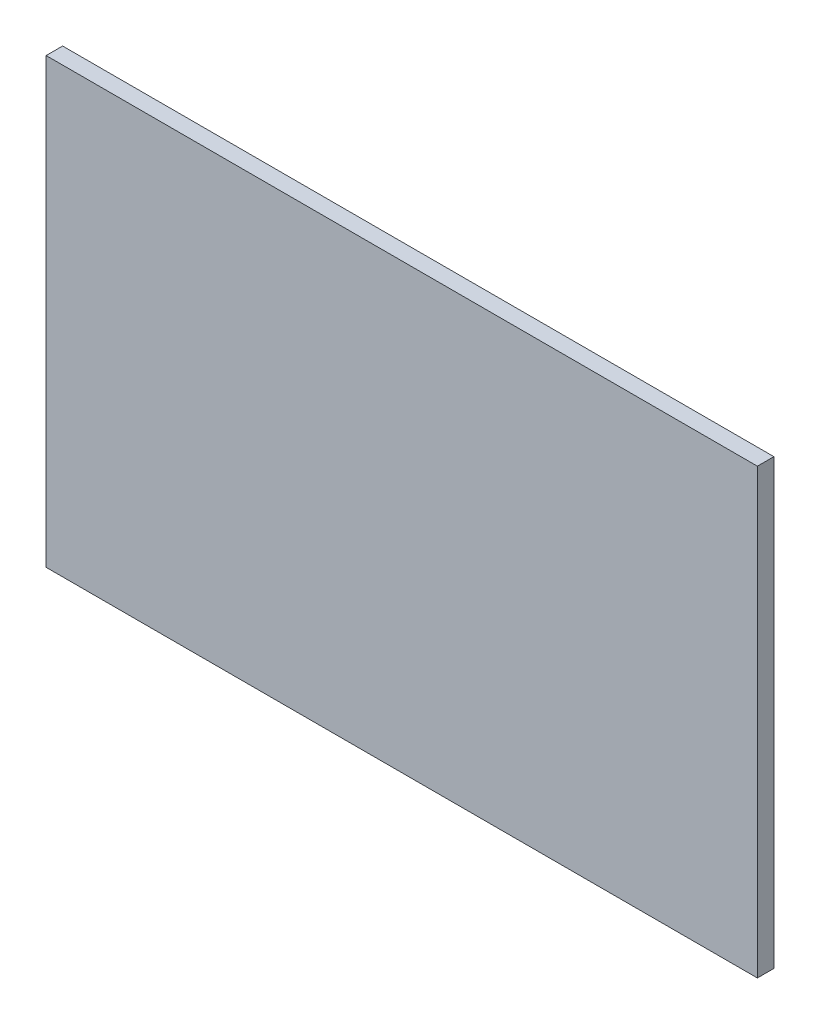
ISO-10303-21;
HEADER;
FILE_DESCRIPTION(('STEP AP214'),'2;1');
FILE_NAME('part.step','',(''),(''),'','','');
FILE_SCHEMA(('AUTOMOTIVE_DESIGN { 1 0 10303 214 1 1 1 1 }'));
ENDSEC;
DATA;
#1=APPLICATION_CONTEXT('core data for automotive mechanical design processes');
#2=APPLICATION_PROTOCOL_DEFINITION('international standard','automotive_design',2000,#1);
#3=PRODUCT_CONTEXT('',#1,'mechanical');
#4=PRODUCT('Part','Part','',(#3));
#5=PRODUCT_RELATED_PRODUCT_CATEGORY('part','',(#4));
#6=PRODUCT_DEFINITION_FORMATION('','',#4);
#7=PRODUCT_DEFINITION_CONTEXT('part definition',#1,'design');
#8=PRODUCT_DEFINITION('design','',#6,#7);
#9=PRODUCT_DEFINITION_SHAPE('','',#8);
#10=(LENGTH_UNIT() NAMED_UNIT(*) SI_UNIT(.MILLI.,.METRE.));
#11=(NAMED_UNIT(*) PLANE_ANGLE_UNIT() SI_UNIT($,.RADIAN.));
#12=(NAMED_UNIT(*) SI_UNIT($,.STERADIAN.) SOLID_ANGLE_UNIT());
#13=UNCERTAINTY_MEASURE_WITH_UNIT(LENGTH_MEASURE(1.E-05),#10,'distance_accuracy_value','');
#14=(GEOMETRIC_REPRESENTATION_CONTEXT(3) GLOBAL_UNCERTAINTY_ASSIGNED_CONTEXT((#13)) GLOBAL_UNIT_ASSIGNED_CONTEXT((#10,
#11,#12)) REPRESENTATION_CONTEXT('',''));
#15=CARTESIAN_POINT('',(0.,0.,0.));
#16=DIRECTION('',(0.,0.,1.));
#17=DIRECTION('',(1.,0.,0.));
#18=AXIS2_PLACEMENT_3D('',#15,#16,#17);
#19=CARTESIAN_POINT('',(69.,-43.,3.2));
#20=DIRECTION('',(-1.,0.,0.));
#21=DIRECTION('',(0.,0.,1.));
#22=AXIS2_PLACEMENT_3D('',#19,#20,#21);
#23=PLANE('',#22);
#24=DIRECTION('',(0.,1.,0.));
#25=VECTOR('',#24,1.);
#26=CARTESIAN_POINT('',(69.,-43.,0.));
#27=LINE('',#26,#25);
#28=CARTESIAN_POINT('',(69.,-43.,0.));
#29=VERTEX_POINT('',#28);
#30=CARTESIAN_POINT('',(69.,43.,0.));
#31=VERTEX_POINT('',#30);
#32=EDGE_CURVE('E107',#29,#31,#27,.T.);
#33=ORIENTED_EDGE('',*,*,#32,.T.);
#34=DIRECTION('',(0.,0.,-1.));
#35=VECTOR('',#34,1.);
#36=CARTESIAN_POINT('',(69.,43.,3.2));
#37=LINE('',#36,#35);
#38=CARTESIAN_POINT('',(69.,43.,3.2));
#39=VERTEX_POINT('',#38);
#40=EDGE_CURVE('E11',#39,#31,#37,.T.);
#41=ORIENTED_EDGE('',*,*,#40,.F.);
#42=DIRECTION('',(0.,1.,0.));
#43=VECTOR('',#42,1.);
#44=CARTESIAN_POINT('',(69.,-43.,3.2));
#45=LINE('',#44,#43);
#46=CARTESIAN_POINT('',(69.,-43.,3.2));
#47=VERTEX_POINT('',#46);
#48=EDGE_CURVE('E91',#47,#39,#45,.T.);
#49=ORIENTED_EDGE('',*,*,#48,.F.);
#50=DIRECTION('',(0.,0.,-1.));
#51=VECTOR('',#50,1.);
#52=CARTESIAN_POINT('',(69.,-43.,3.2));
#53=LINE('',#52,#51);
#54=EDGE_CURVE('E103',#47,#29,#53,.T.);
#55=ORIENTED_EDGE('',*,*,#54,.T.);
#56=EDGE_LOOP('',(#33,#41,#49,#55));
#57=FACE_BOUND('',#56,.T.);
#58=ADVANCED_FACE('F39',(#57),#23,.F.);
#59=CARTESIAN_POINT('',(-69.,43.,3.2));
#60=DIRECTION('',(0.,-1.,0.));
#61=DIRECTION('',(0.,0.,-1.));
#62=AXIS2_PLACEMENT_3D('',#59,#60,#61);
#63=PLANE('',#62);
#64=DIRECTION('',(-1.,0.,0.));
#65=VECTOR('',#64,1.);
#66=CARTESIAN_POINT('',(-69.,43.,0.));
#67=LINE('',#66,#65);
#68=CARTESIAN_POINT('',(-69.,43.,0.));
#69=VERTEX_POINT('',#68);
#70=EDGE_CURVE('E96',#31,#69,#67,.T.);
#71=ORIENTED_EDGE('',*,*,#70,.T.);
#72=DIRECTION('',(0.,0.,-1.));
#73=VECTOR('',#72,1.);
#74=CARTESIAN_POINT('',(-69.,43.,3.2));
#75=LINE('',#74,#73);
#76=CARTESIAN_POINT('',(-69.,43.,3.2));
#77=VERTEX_POINT('',#76);
#78=EDGE_CURVE('E48',#77,#69,#75,.T.);
#79=ORIENTED_EDGE('',*,*,#78,.F.);
#80=DIRECTION('',(-1.,0.,0.));
#81=VECTOR('',#80,1.);
#82=CARTESIAN_POINT('',(-69.,43.,3.2));
#83=LINE('',#82,#81);
#84=EDGE_CURVE('E86',#39,#77,#83,.T.);
#85=ORIENTED_EDGE('',*,*,#84,.F.);
#86=ORIENTED_EDGE('',*,*,#40,.T.);
#87=EDGE_LOOP('',(#71,#79,#85,#86));
#88=FACE_BOUND('',#87,.T.);
#89=ADVANCED_FACE('F95',(#88),#63,.F.);
#90=CARTESIAN_POINT('',(-69.,-43.,3.2));
#91=DIRECTION('',(1.,0.,0.));
#92=DIRECTION('',(0.,0.,-1.));
#93=AXIS2_PLACEMENT_3D('',#90,#91,#92);
#94=PLANE('',#93);
#95=DIRECTION('',(0.,-1.,0.));
#96=VECTOR('',#95,1.);
#97=CARTESIAN_POINT('',(-69.,-43.,0.));
#98=LINE('',#97,#96);
#99=CARTESIAN_POINT('',(-69.,-43.,0.));
#100=VERTEX_POINT('',#99);
#101=EDGE_CURVE('E73',#69,#100,#98,.T.);
#102=ORIENTED_EDGE('',*,*,#101,.T.);
#103=DIRECTION('',(0.,0.,-1.));
#104=VECTOR('',#103,1.);
#105=CARTESIAN_POINT('',(-69.,-43.,3.2));
#106=LINE('',#105,#104);
#107=CARTESIAN_POINT('',(-69.,-43.,3.2));
#108=VERTEX_POINT('',#107);
#109=EDGE_CURVE('E98',#108,#100,#106,.T.);
#110=ORIENTED_EDGE('',*,*,#109,.F.);
#111=DIRECTION('',(0.,-1.,0.));
#112=VECTOR('',#111,1.);
#113=CARTESIAN_POINT('',(-69.,-43.,3.2));
#114=LINE('',#113,#112);
#115=EDGE_CURVE('E89',#77,#108,#114,.T.);
#116=ORIENTED_EDGE('',*,*,#115,.F.);
#117=ORIENTED_EDGE('',*,*,#78,.T.);
#118=EDGE_LOOP('',(#102,#110,#116,#117));
#119=FACE_BOUND('',#118,.T.);
#120=ADVANCED_FACE('F99',(#119),#94,.F.);
#121=CARTESIAN_POINT('',(-69.,-43.,3.2));
#122=DIRECTION('',(0.,1.,0.));
#123=DIRECTION('',(0.,0.,1.));
#124=AXIS2_PLACEMENT_3D('',#121,#122,#123);
#125=PLANE('',#124);
#126=DIRECTION('',(1.,0.,0.));
#127=VECTOR('',#126,1.);
#128=CARTESIAN_POINT('',(-69.,-43.,0.));
#129=LINE('',#128,#127);
#130=EDGE_CURVE('E79',#100,#29,#129,.T.);
#131=ORIENTED_EDGE('',*,*,#130,.T.);
#132=ORIENTED_EDGE('',*,*,#54,.F.);
#133=DIRECTION('',(1.,0.,0.));
#134=VECTOR('',#133,1.);
#135=CARTESIAN_POINT('',(-69.,-43.,3.2));
#136=LINE('',#135,#134);
#137=EDGE_CURVE('E56',#108,#47,#136,.T.);
#138=ORIENTED_EDGE('',*,*,#137,.F.);
#139=ORIENTED_EDGE('',*,*,#109,.T.);
#140=EDGE_LOOP('',(#131,#132,#138,#139));
#141=FACE_BOUND('',#140,.T.);
#142=ADVANCED_FACE('F120',(#141),#125,.F.);
#143=CARTESIAN_POINT('',(0.,0.,3.2));
#144=DIRECTION('',(0.,0.,-1.));
#145=DIRECTION('',(-1.,0.,0.));
#146=AXIS2_PLACEMENT_3D('',#143,#144,#145);
#147=PLANE('',#146);
#148=ORIENTED_EDGE('',*,*,#48,.T.);
#149=ORIENTED_EDGE('',*,*,#84,.T.);
#150=ORIENTED_EDGE('',*,*,#115,.T.);
#151=ORIENTED_EDGE('',*,*,#137,.T.);
#152=EDGE_LOOP('',(#148,#149,#150,#151));
#153=FACE_BOUND('',#152,.T.);
#154=ADVANCED_FACE('F87',(#153),#147,.F.);
#155=CARTESIAN_POINT('',(0.,0.,0.));
#156=DIRECTION('',(0.,0.,-1.));
#157=DIRECTION('',(-1.,0.,0.));
#158=AXIS2_PLACEMENT_3D('',#155,#156,#157);
#159=PLANE('',#158);
#160=ORIENTED_EDGE('',*,*,#32,.F.);
#161=ORIENTED_EDGE('',*,*,#130,.F.);
#162=ORIENTED_EDGE('',*,*,#101,.F.);
#163=ORIENTED_EDGE('',*,*,#70,.F.);
#164=EDGE_LOOP('',(#160,#161,#162,#163));
#165=FACE_BOUND('',#164,.T.);
#166=ADVANCED_FACE('F123',(#165),#159,.T.);
#167=CLOSED_SHELL('',(#58,#89,#120,#142,#154,#166));
#168=MANIFOLD_SOLID_BREP('B2',#167);
#169=ADVANCED_BREP_SHAPE_REPRESENTATION('',(#18,#168),#14);
#170=SHAPE_DEFINITION_REPRESENTATION(#9,#169);
ENDSEC;
END-ISO-10303-21;
